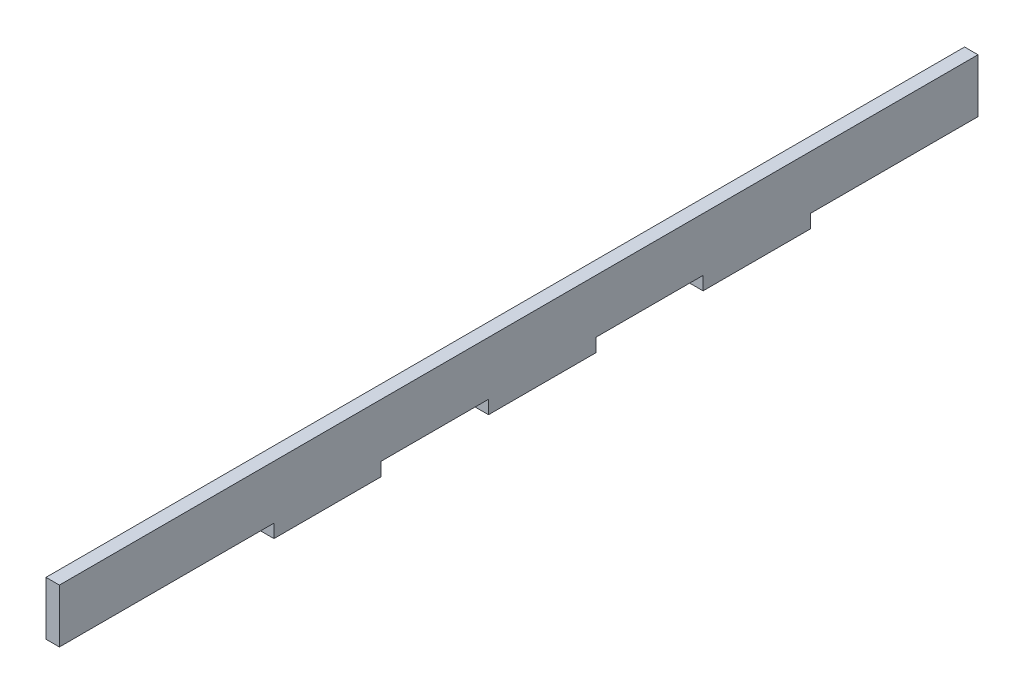
ISO-10303-21;
HEADER;
FILE_DESCRIPTION(('STEP AP214'),'2;1');
FILE_NAME('part.step','',(''),(''),'','','');
FILE_SCHEMA(('AUTOMOTIVE_DESIGN { 1 0 10303 214 1 1 1 1 }'));
ENDSEC;
DATA;
#1=APPLICATION_CONTEXT('core data for automotive mechanical design processes');
#2=APPLICATION_PROTOCOL_DEFINITION('international standard','automotive_design',2000,#1);
#3=PRODUCT_CONTEXT('',#1,'mechanical');
#4=PRODUCT('Part','Part','',(#3));
#5=PRODUCT_RELATED_PRODUCT_CATEGORY('part','',(#4));
#6=PRODUCT_DEFINITION_FORMATION('','',#4);
#7=PRODUCT_DEFINITION_CONTEXT('part definition',#1,'design');
#8=PRODUCT_DEFINITION('design','',#6,#7);
#9=PRODUCT_DEFINITION_SHAPE('','',#8);
#10=(LENGTH_UNIT() NAMED_UNIT(*) SI_UNIT(.MILLI.,.METRE.));
#11=(NAMED_UNIT(*) PLANE_ANGLE_UNIT() SI_UNIT($,.RADIAN.));
#12=(NAMED_UNIT(*) SI_UNIT($,.STERADIAN.) SOLID_ANGLE_UNIT());
#13=UNCERTAINTY_MEASURE_WITH_UNIT(LENGTH_MEASURE(1.E-05),#10,'distance_accuracy_value','');
#14=(GEOMETRIC_REPRESENTATION_CONTEXT(3) GLOBAL_UNCERTAINTY_ASSIGNED_CONTEXT((#13)) GLOBAL_UNIT_ASSIGNED_CONTEXT((#10,
#11,#12)) REPRESENTATION_CONTEXT('',''));
#15=CARTESIAN_POINT('',(0.,0.,0.));
#16=DIRECTION('',(0.,0.,1.));
#17=DIRECTION('',(1.,0.,0.));
#18=AXIS2_PLACEMENT_3D('',#15,#16,#17);
#19=CARTESIAN_POINT('',(6.35,0.,-3.13101566359819));
#20=DIRECTION('',(0.,1.,0.));
#21=DIRECTION('',(0.,0.,1.));
#22=AXIS2_PLACEMENT_3D('',#19,#20,#21);
#23=PLANE('',#22);
#24=DIRECTION('',(0.,0.,-1.));
#25=VECTOR('',#24,1.);
#26=CARTESIAN_POINT('',(0.,0.,-3.13101566359819));
#27=LINE('',#26,#25);
#28=CARTESIAN_POINT('',(0.,0.,-104.731015663598));
#29=VERTEX_POINT('',#28);
#30=CARTESIAN_POINT('',(0.,0.,-155.531015663598));
#31=VERTEX_POINT('',#30);
#32=EDGE_CURVE('E253',#29,#31,#27,.T.);
#33=ORIENTED_EDGE('',*,*,#32,.T.);
#34=DIRECTION('',(-1.,0.,0.));
#35=VECTOR('',#34,1.);
#36=CARTESIAN_POINT('',(6.351,0.,-155.531015663598));
#37=LINE('',#36,#35);
#38=CARTESIAN_POINT('',(6.35,0.,-155.531015663598));
#39=VERTEX_POINT('',#38);
#40=EDGE_CURVE('E162',#39,#31,#37,.T.);
#41=ORIENTED_EDGE('',*,*,#40,.F.);
#42=DIRECTION('',(0.,0.,-1.));
#43=VECTOR('',#42,1.);
#44=CARTESIAN_POINT('',(6.35,0.,-3.13101566359819));
#45=LINE('',#44,#43);
#46=CARTESIAN_POINT('',(6.35,0.,-104.731015663598));
#47=VERTEX_POINT('',#46);
#48=EDGE_CURVE('E168',#47,#39,#45,.T.);
#49=ORIENTED_EDGE('',*,*,#48,.F.);
#50=DIRECTION('',(-1.,0.,0.));
#51=VECTOR('',#50,1.);
#52=CARTESIAN_POINT('',(6.351,0.,-104.731015663598));
#53=LINE('',#52,#51);
#54=EDGE_CURVE('E230',#47,#29,#53,.T.);
#55=ORIENTED_EDGE('',*,*,#54,.T.);
#56=EDGE_LOOP('',(#33,#41,#49,#55));
#57=FACE_BOUND('',#56,.T.);
#58=ADVANCED_FACE('F33',(#57),#23,.F.);
#59=CARTESIAN_POINT('',(6.35,0.,-206.331015663598));
#60=VERTEX_POINT('',#59);
#61=CARTESIAN_POINT('',(6.35,0.,-257.131015663598));
#62=VERTEX_POINT('',#61);
#63=EDGE_CURVE('E246',#60,#62,#45,.T.);
#64=ORIENTED_EDGE('',*,*,#63,.F.);
#65=DIRECTION('',(-1.,0.,0.));
#66=VECTOR('',#65,1.);
#67=CARTESIAN_POINT('',(6.351,0.,-206.331015663598));
#68=LINE('',#67,#66);
#69=CARTESIAN_POINT('',(0.,0.,-206.331015663598));
#70=VERTEX_POINT('',#69);
#71=EDGE_CURVE('E179',#60,#70,#68,.T.);
#72=ORIENTED_EDGE('',*,*,#71,.T.);
#73=CARTESIAN_POINT('',(0.,0.,-257.131015663598));
#74=VERTEX_POINT('',#73);
#75=EDGE_CURVE('E257',#70,#74,#27,.T.);
#76=ORIENTED_EDGE('',*,*,#75,.T.);
#77=DIRECTION('',(-1.,0.,0.));
#78=VECTOR('',#77,1.);
#79=CARTESIAN_POINT('',(6.351,0.,-257.131015663598));
#80=LINE('',#79,#78);
#81=EDGE_CURVE('E196',#62,#74,#80,.T.);
#82=ORIENTED_EDGE('',*,*,#81,.F.);
#83=EDGE_LOOP('',(#64,#72,#76,#82));
#84=FACE_BOUND('',#83,.T.);
#85=ADVANCED_FACE('F304',(#84),#23,.F.);
#86=CARTESIAN_POINT('',(6.35,0.,-3.13101566359819));
#87=DIRECTION('',(0.,0.,-1.));
#88=DIRECTION('',(-1.,0.,0.));
#89=AXIS2_PLACEMENT_3D('',#86,#87,#88);
#90=PLANE('',#89);
#91=DIRECTION('',(0.,-1.,0.));
#92=VECTOR('',#91,1.);
#93=CARTESIAN_POINT('',(0.,0.,-3.13101566359819));
#94=LINE('',#93,#92);
#95=CARTESIAN_POINT('',(0.,31.75,-3.13101566359819));
#96=VERTEX_POINT('',#95);
#97=CARTESIAN_POINT('',(0.,6.34999999999999,-3.13101566359819));
#98=VERTEX_POINT('',#97);
#99=EDGE_CURVE('E238',#96,#98,#94,.T.);
#100=ORIENTED_EDGE('',*,*,#99,.T.);
#101=DIRECTION('',(-1.,0.,0.));
#102=VECTOR('',#101,1.);
#103=CARTESIAN_POINT('',(6.351,6.35,-3.13101566359819));
#104=LINE('',#103,#102);
#105=CARTESIAN_POINT('',(6.35,6.34999999999999,-3.13101566359819));
#106=VERTEX_POINT('',#105);
#107=EDGE_CURVE('E229',#106,#98,#104,.T.);
#108=ORIENTED_EDGE('',*,*,#107,.F.);
#109=DIRECTION('',(0.,-1.,0.));
#110=VECTOR('',#109,1.);
#111=CARTESIAN_POINT('',(6.35,0.,-3.13101566359819));
#112=LINE('',#111,#110);
#113=CARTESIAN_POINT('',(6.35,31.75,-3.13101566359819));
#114=VERTEX_POINT('',#113);
#115=EDGE_CURVE('E239',#114,#106,#112,.T.);
#116=ORIENTED_EDGE('',*,*,#115,.F.);
#117=DIRECTION('',(-1.,0.,0.));
#118=VECTOR('',#117,1.);
#119=CARTESIAN_POINT('',(6.35,31.75,-3.13101566359819));
#120=LINE('',#119,#118);
#121=EDGE_CURVE('E41',#114,#96,#120,.T.);
#122=ORIENTED_EDGE('',*,*,#121,.T.);
#123=EDGE_LOOP('',(#100,#108,#116,#122));
#124=FACE_BOUND('',#123,.T.);
#125=ADVANCED_FACE('F35',(#124),#90,.F.);
#126=CARTESIAN_POINT('',(6.35,0.,-307.931015663598));
#127=VERTEX_POINT('',#126);
#128=CARTESIAN_POINT('',(6.35,0.,-358.731015663598));
#129=VERTEX_POINT('',#128);
#130=EDGE_CURVE('E242',#127,#129,#45,.T.);
#131=ORIENTED_EDGE('',*,*,#130,.F.);
#132=DIRECTION('',(-1.,0.,0.));
#133=VECTOR('',#132,1.);
#134=CARTESIAN_POINT('',(6.351,0.,-307.931015663598));
#135=LINE('',#134,#133);
#136=CARTESIAN_POINT('',(0.,0.,-307.931015663598));
#137=VERTEX_POINT('',#136);
#138=EDGE_CURVE('E198',#127,#137,#135,.T.);
#139=ORIENTED_EDGE('',*,*,#138,.T.);
#140=CARTESIAN_POINT('',(0.,0.,-358.731015663598));
#141=VERTEX_POINT('',#140);
#142=EDGE_CURVE('E252',#137,#141,#27,.T.);
#143=ORIENTED_EDGE('',*,*,#142,.T.);
#144=DIRECTION('',(-1.,0.,0.));
#145=VECTOR('',#144,1.);
#146=CARTESIAN_POINT('',(6.351,0.,-358.731015663598));
#147=LINE('',#146,#145);
#148=EDGE_CURVE('E216',#129,#141,#147,.T.);
#149=ORIENTED_EDGE('',*,*,#148,.F.);
#150=EDGE_LOOP('',(#131,#139,#143,#149));
#151=FACE_BOUND('',#150,.T.);
#152=ADVANCED_FACE('F296',(#151),#23,.F.);
#153=CARTESIAN_POINT('',(6.35,0.,-438.131015663598));
#154=DIRECTION('',(0.,0.,1.));
#155=DIRECTION('',(1.,0.,0.));
#156=AXIS2_PLACEMENT_3D('',#153,#154,#155);
#157=PLANE('',#156);
#158=DIRECTION('',(0.,1.,0.));
#159=VECTOR('',#158,1.);
#160=CARTESIAN_POINT('',(6.35,0.,-438.131015663598));
#161=LINE('',#160,#159);
#162=CARTESIAN_POINT('',(6.35,6.34999999999995,-438.131015663598));
#163=VERTEX_POINT('',#162);
#164=CARTESIAN_POINT('',(6.35,31.75,-438.131015663598));
#165=VERTEX_POINT('',#164);
#166=EDGE_CURVE('E245',#163,#165,#161,.T.);
#167=ORIENTED_EDGE('',*,*,#166,.F.);
#168=DIRECTION('',(-1.,0.,0.));
#169=VECTOR('',#168,1.);
#170=CARTESIAN_POINT('',(6.351,6.34999999999995,-438.131015663598));
#171=LINE('',#170,#169);
#172=CARTESIAN_POINT('',(0.,6.34999999999995,-438.131015663598));
#173=VERTEX_POINT('',#172);
#174=EDGE_CURVE('E187',#163,#173,#171,.T.);
#175=ORIENTED_EDGE('',*,*,#174,.T.);
#176=DIRECTION('',(0.,1.,0.));
#177=VECTOR('',#176,1.);
#178=CARTESIAN_POINT('',(0.,0.,-438.131015663598));
#179=LINE('',#178,#177);
#180=CARTESIAN_POINT('',(0.,31.75,-438.131015663598));
#181=VERTEX_POINT('',#180);
#182=EDGE_CURVE('E256',#173,#181,#179,.T.);
#183=ORIENTED_EDGE('',*,*,#182,.T.);
#184=DIRECTION('',(-1.,0.,0.));
#185=VECTOR('',#184,1.);
#186=CARTESIAN_POINT('',(6.35,31.75,-438.131015663598));
#187=LINE('',#186,#185);
#188=EDGE_CURVE('E11',#165,#181,#187,.T.);
#189=ORIENTED_EDGE('',*,*,#188,.F.);
#190=EDGE_LOOP('',(#167,#175,#183,#189));
#191=FACE_BOUND('',#190,.T.);
#192=ADVANCED_FACE('F282',(#191),#157,.F.);
#193=CARTESIAN_POINT('',(6.35,31.75,-3.13101566359819));
#194=DIRECTION('',(0.,-1.,0.));
#195=DIRECTION('',(0.,0.,-1.));
#196=AXIS2_PLACEMENT_3D('',#193,#194,#195);
#197=PLANE('',#196);
#198=DIRECTION('',(0.,0.,1.));
#199=VECTOR('',#198,1.);
#200=CARTESIAN_POINT('',(0.,31.75,-3.13101566359819));
#201=LINE('',#200,#199);
#202=EDGE_CURVE('E243',#181,#96,#201,.T.);
#203=ORIENTED_EDGE('',*,*,#202,.T.);
#204=ORIENTED_EDGE('',*,*,#121,.F.);
#205=DIRECTION('',(0.,0.,1.));
#206=VECTOR('',#205,1.);
#207=CARTESIAN_POINT('',(6.35,31.75,-3.13101566359819));
#208=LINE('',#207,#206);
#209=EDGE_CURVE('E248',#165,#114,#208,.T.);
#210=ORIENTED_EDGE('',*,*,#209,.F.);
#211=ORIENTED_EDGE('',*,*,#188,.T.);
#212=EDGE_LOOP('',(#203,#204,#210,#211));
#213=FACE_BOUND('',#212,.T.);
#214=ADVANCED_FACE('F280',(#213),#197,.F.);
#215=CARTESIAN_POINT('',(6.35,0.,0.));
#216=DIRECTION('',(-1.,0.,0.));
#217=DIRECTION('',(0.,0.,1.));
#218=AXIS2_PLACEMENT_3D('',#215,#216,#217);
#219=PLANE('',#218);
#220=ORIENTED_EDGE('',*,*,#48,.T.);
#221=DIRECTION('',(0.,-1.,0.));
#222=VECTOR('',#221,1.);
#223=CARTESIAN_POINT('',(6.35,0.,-155.531015663598));
#224=LINE('',#223,#222);
#225=CARTESIAN_POINT('',(6.35,6.34999999999998,-155.531015663598));
#226=VERTEX_POINT('',#225);
#227=EDGE_CURVE('E147',#226,#39,#224,.T.);
#228=ORIENTED_EDGE('',*,*,#227,.F.);
#229=DIRECTION('',(0.,0.,1.));
#230=VECTOR('',#229,1.);
#231=CARTESIAN_POINT('',(6.35,6.34999999999998,-155.531015663598));
#232=LINE('',#231,#230);
#233=CARTESIAN_POINT('',(6.35,6.34999999999998,-206.331015663598));
#234=VERTEX_POINT('',#233);
#235=EDGE_CURVE('E156',#234,#226,#232,.T.);
#236=ORIENTED_EDGE('',*,*,#235,.F.);
#237=DIRECTION('',(0.,1.,0.));
#238=VECTOR('',#237,1.);
#239=CARTESIAN_POINT('',(6.35,0.,-206.331015663598));
#240=LINE('',#239,#238);
#241=EDGE_CURVE('E169',#60,#234,#240,.T.);
#242=ORIENTED_EDGE('',*,*,#241,.F.);
#243=ORIENTED_EDGE('',*,*,#63,.T.);
#244=DIRECTION('',(0.,-1.,0.));
#245=VECTOR('',#244,1.);
#246=CARTESIAN_POINT('',(6.35,0.,-257.131015663598));
#247=LINE('',#246,#245);
#248=CARTESIAN_POINT('',(6.35,6.34999999999998,-257.131015663598));
#249=VERTEX_POINT('',#248);
#250=EDGE_CURVE('E186',#249,#62,#247,.T.);
#251=ORIENTED_EDGE('',*,*,#250,.F.);
#252=DIRECTION('',(0.,0.,1.));
#253=VECTOR('',#252,1.);
#254=CARTESIAN_POINT('',(6.35,6.34999999999998,-257.131015663598));
#255=LINE('',#254,#253);
#256=CARTESIAN_POINT('',(6.35,6.34999999999997,-307.931015663598));
#257=VERTEX_POINT('',#256);
#258=EDGE_CURVE('E173',#257,#249,#255,.T.);
#259=ORIENTED_EDGE('',*,*,#258,.F.);
#260=DIRECTION('',(0.,1.,0.));
#261=VECTOR('',#260,1.);
#262=CARTESIAN_POINT('',(6.35,0.,-307.931015663598));
#263=LINE('',#262,#261);
#264=EDGE_CURVE('E183',#127,#257,#263,.T.);
#265=ORIENTED_EDGE('',*,*,#264,.F.);
#266=ORIENTED_EDGE('',*,*,#130,.T.);
#267=DIRECTION('',(0.,-1.,0.));
#268=VECTOR('',#267,1.);
#269=CARTESIAN_POINT('',(6.35,0.,-358.731015663598));
#270=LINE('',#269,#268);
#271=CARTESIAN_POINT('',(6.35,6.34999999999991,-358.731015663598));
#272=VERTEX_POINT('',#271);
#273=EDGE_CURVE('E206',#272,#129,#270,.T.);
#274=ORIENTED_EDGE('',*,*,#273,.F.);
#275=DIRECTION('',(0.,0.,1.));
#276=VECTOR('',#275,1.);
#277=CARTESIAN_POINT('',(6.35,6.34999999999995,-438.131015663598));
#278=LINE('',#277,#276);
#279=EDGE_CURVE('E208',#163,#272,#278,.T.);
#280=ORIENTED_EDGE('',*,*,#279,.F.);
#281=ORIENTED_EDGE('',*,*,#166,.T.);
#282=ORIENTED_EDGE('',*,*,#209,.T.);
#283=ORIENTED_EDGE('',*,*,#115,.T.);
#284=DIRECTION('',(0.,0.,1.));
#285=VECTOR('',#284,1.);
#286=CARTESIAN_POINT('',(6.35,6.35,-3.13101566359819));
#287=LINE('',#286,#285);
#288=CARTESIAN_POINT('',(6.35,6.34999999999999,-104.731015663598));
#289=VERTEX_POINT('',#288);
#290=EDGE_CURVE('E233',#289,#106,#287,.T.);
#291=ORIENTED_EDGE('',*,*,#290,.F.);
#292=DIRECTION('',(0.,1.,0.));
#293=VECTOR('',#292,1.);
#294=CARTESIAN_POINT('',(6.35,0.,-104.731015663598));
#295=LINE('',#294,#293);
#296=EDGE_CURVE('E161',#47,#289,#295,.T.);
#297=ORIENTED_EDGE('',*,*,#296,.F.);
#298=EDGE_LOOP('',(#220,#228,#236,#242,#243,#251,#259,#265,#266,#274,#280,#281,#282,#283,#291,#297));
#299=FACE_BOUND('',#298,.T.);
#300=ADVANCED_FACE('F165',(#299),#219,.F.);
#301=CARTESIAN_POINT('',(0.,0.,0.));
#302=DIRECTION('',(-1.,0.,0.));
#303=DIRECTION('',(0.,0.,1.));
#304=AXIS2_PLACEMENT_3D('',#301,#302,#303);
#305=PLANE('',#304);
#306=DIRECTION('',(0.,1.,0.));
#307=VECTOR('',#306,1.);
#308=CARTESIAN_POINT('',(0.,0.,-155.531015663598));
#309=LINE('',#308,#307);
#310=CARTESIAN_POINT('',(0.,6.34999999999998,-155.531015663598));
#311=VERTEX_POINT('',#310);
#312=EDGE_CURVE('E48',#31,#311,#309,.T.);
#313=ORIENTED_EDGE('',*,*,#312,.F.);
#314=ORIENTED_EDGE('',*,*,#32,.F.);
#315=DIRECTION('',(0.,-1.,0.));
#316=VECTOR('',#315,1.);
#317=CARTESIAN_POINT('',(0.,0.,-104.731015663598));
#318=LINE('',#317,#316);
#319=CARTESIAN_POINT('',(0.,6.34999999999999,-104.731015663598));
#320=VERTEX_POINT('',#319);
#321=EDGE_CURVE('E227',#320,#29,#318,.T.);
#322=ORIENTED_EDGE('',*,*,#321,.F.);
#323=DIRECTION('',(0.,0.,-1.));
#324=VECTOR('',#323,1.);
#325=CARTESIAN_POINT('',(0.,6.35,-3.13101566359819));
#326=LINE('',#325,#324);
#327=EDGE_CURVE('E224',#98,#320,#326,.T.);
#328=ORIENTED_EDGE('',*,*,#327,.F.);
#329=ORIENTED_EDGE('',*,*,#99,.F.);
#330=ORIENTED_EDGE('',*,*,#202,.F.);
#331=ORIENTED_EDGE('',*,*,#182,.F.);
#332=DIRECTION('',(0.,0.,-1.));
#333=VECTOR('',#332,1.);
#334=CARTESIAN_POINT('',(0.,6.34999999999995,-438.131015663598));
#335=LINE('',#334,#333);
#336=CARTESIAN_POINT('',(0.,6.34999999999991,-358.731015663598));
#337=VERTEX_POINT('',#336);
#338=EDGE_CURVE('E214',#337,#173,#335,.T.);
#339=ORIENTED_EDGE('',*,*,#338,.F.);
#340=DIRECTION('',(0.,1.,0.));
#341=VECTOR('',#340,1.);
#342=CARTESIAN_POINT('',(0.,0.,-358.731015663598));
#343=LINE('',#342,#341);
#344=EDGE_CURVE('E211',#141,#337,#343,.T.);
#345=ORIENTED_EDGE('',*,*,#344,.F.);
#346=ORIENTED_EDGE('',*,*,#142,.F.);
#347=DIRECTION('',(0.,-1.,0.));
#348=VECTOR('',#347,1.);
#349=CARTESIAN_POINT('',(0.,0.,-307.931015663598));
#350=LINE('',#349,#348);
#351=CARTESIAN_POINT('',(0.,6.34999999999997,-307.931015663598));
#352=VERTEX_POINT('',#351);
#353=EDGE_CURVE('E193',#352,#137,#350,.T.);
#354=ORIENTED_EDGE('',*,*,#353,.F.);
#355=DIRECTION('',(0.,0.,-1.));
#356=VECTOR('',#355,1.);
#357=CARTESIAN_POINT('',(0.,6.34999999999998,-257.131015663598));
#358=LINE('',#357,#356);
#359=CARTESIAN_POINT('',(0.,6.34999999999998,-257.131015663598));
#360=VERTEX_POINT('',#359);
#361=EDGE_CURVE('E190',#360,#352,#358,.T.);
#362=ORIENTED_EDGE('',*,*,#361,.F.);
#363=DIRECTION('',(0.,1.,0.));
#364=VECTOR('',#363,1.);
#365=CARTESIAN_POINT('',(0.,0.,-257.131015663598));
#366=LINE('',#365,#364);
#367=EDGE_CURVE('E56',#74,#360,#366,.T.);
#368=ORIENTED_EDGE('',*,*,#367,.F.);
#369=ORIENTED_EDGE('',*,*,#75,.F.);
#370=DIRECTION('',(0.,-1.,0.));
#371=VECTOR('',#370,1.);
#372=CARTESIAN_POINT('',(0.,0.,-206.331015663598));
#373=LINE('',#372,#371);
#374=CARTESIAN_POINT('',(0.,6.34999999999998,-206.331015663598));
#375=VERTEX_POINT('',#374);
#376=EDGE_CURVE('E153',#375,#70,#373,.T.);
#377=ORIENTED_EDGE('',*,*,#376,.F.);
#378=DIRECTION('',(0.,0.,-1.));
#379=VECTOR('',#378,1.);
#380=CARTESIAN_POINT('',(0.,6.34999999999998,-155.531015663598));
#381=LINE('',#380,#379);
#382=EDGE_CURVE('E171',#311,#375,#381,.T.);
#383=ORIENTED_EDGE('',*,*,#382,.F.);
#384=EDGE_LOOP('',(#313,#314,#322,#328,#329,#330,#331,#339,#345,#346,#354,#362,#368,#369,#377,#383));
#385=FACE_BOUND('',#384,.T.);
#386=ADVANCED_FACE('F270',(#385),#305,.T.);
#387=CARTESIAN_POINT('',(6.351,0.,-104.731015663598));
#388=DIRECTION('',(0.,0.,-1.));
#389=DIRECTION('',(-1.,0.,0.));
#390=AXIS2_PLACEMENT_3D('',#387,#388,#389);
#391=PLANE('',#390);
#392=ORIENTED_EDGE('',*,*,#296,.T.);
#393=DIRECTION('',(-1.,0.,0.));
#394=VECTOR('',#393,1.);
#395=CARTESIAN_POINT('',(6.351,6.34999999999999,-104.731015663598));
#396=LINE('',#395,#394);
#397=EDGE_CURVE('E234',#289,#320,#396,.T.);
#398=ORIENTED_EDGE('',*,*,#397,.T.);
#399=ORIENTED_EDGE('',*,*,#321,.T.);
#400=ORIENTED_EDGE('',*,*,#54,.F.);
#401=EDGE_LOOP('',(#392,#398,#399,#400));
#402=FACE_BOUND('',#401,.T.);
#403=ADVANCED_FACE('F376',(#402),#391,.F.);
#404=CARTESIAN_POINT('',(6.351,6.35,-3.13101566359819));
#405=DIRECTION('',(0.,1.,0.));
#406=DIRECTION('',(0.,0.,1.));
#407=AXIS2_PLACEMENT_3D('',#404,#405,#406);
#408=PLANE('',#407);
#409=ORIENTED_EDGE('',*,*,#290,.T.);
#410=ORIENTED_EDGE('',*,*,#107,.T.);
#411=ORIENTED_EDGE('',*,*,#327,.T.);
#412=ORIENTED_EDGE('',*,*,#397,.F.);
#413=EDGE_LOOP('',(#409,#410,#411,#412));
#414=FACE_BOUND('',#413,.T.);
#415=ADVANCED_FACE('F275',(#414),#408,.F.);
#416=CARTESIAN_POINT('',(6.351,6.34999999999995,-438.131015663598));
#417=DIRECTION('',(0.,1.,0.));
#418=DIRECTION('',(0.,0.,1.));
#419=AXIS2_PLACEMENT_3D('',#416,#417,#418);
#420=PLANE('',#419);
#421=ORIENTED_EDGE('',*,*,#279,.T.);
#422=DIRECTION('',(-1.,0.,0.));
#423=VECTOR('',#422,1.);
#424=CARTESIAN_POINT('',(6.351,6.34999999999991,-358.731015663598));
#425=LINE('',#424,#423);
#426=EDGE_CURVE('E219',#272,#337,#425,.T.);
#427=ORIENTED_EDGE('',*,*,#426,.T.);
#428=ORIENTED_EDGE('',*,*,#338,.T.);
#429=ORIENTED_EDGE('',*,*,#174,.F.);
#430=EDGE_LOOP('',(#421,#427,#428,#429));
#431=FACE_BOUND('',#430,.T.);
#432=ADVANCED_FACE('F288',(#431),#420,.F.);
#433=CARTESIAN_POINT('',(6.351,0.,-358.731015663598));
#434=DIRECTION('',(0.,0.,1.));
#435=DIRECTION('',(1.,0.,0.));
#436=AXIS2_PLACEMENT_3D('',#433,#434,#435);
#437=PLANE('',#436);
#438=ORIENTED_EDGE('',*,*,#273,.T.);
#439=ORIENTED_EDGE('',*,*,#148,.T.);
#440=ORIENTED_EDGE('',*,*,#344,.T.);
#441=ORIENTED_EDGE('',*,*,#426,.F.);
#442=EDGE_LOOP('',(#438,#439,#440,#441));
#443=FACE_BOUND('',#442,.T.);
#444=ADVANCED_FACE('F291',(#443),#437,.F.);
#445=CARTESIAN_POINT('',(6.351,0.,-257.131015663598));
#446=DIRECTION('',(0.,0.,1.));
#447=DIRECTION('',(1.,0.,0.));
#448=AXIS2_PLACEMENT_3D('',#445,#446,#447);
#449=PLANE('',#448);
#450=ORIENTED_EDGE('',*,*,#250,.T.);
#451=ORIENTED_EDGE('',*,*,#81,.T.);
#452=ORIENTED_EDGE('',*,*,#367,.T.);
#453=DIRECTION('',(-1.,0.,0.));
#454=VECTOR('',#453,1.);
#455=CARTESIAN_POINT('',(6.351,6.34999999999998,-257.131015663598));
#456=LINE('',#455,#454);
#457=EDGE_CURVE('E195',#249,#360,#456,.T.);
#458=ORIENTED_EDGE('',*,*,#457,.F.);
#459=EDGE_LOOP('',(#450,#451,#452,#458));
#460=FACE_BOUND('',#459,.T.);
#461=ADVANCED_FACE('F307',(#460),#449,.F.);
#462=CARTESIAN_POINT('',(6.351,0.,-307.931015663598));
#463=DIRECTION('',(0.,0.,-1.));
#464=DIRECTION('',(-1.,0.,0.));
#465=AXIS2_PLACEMENT_3D('',#462,#463,#464);
#466=PLANE('',#465);
#467=ORIENTED_EDGE('',*,*,#264,.T.);
#468=DIRECTION('',(-1.,0.,0.));
#469=VECTOR('',#468,1.);
#470=CARTESIAN_POINT('',(6.351,6.34999999999997,-307.931015663598));
#471=LINE('',#470,#469);
#472=EDGE_CURVE('E201',#257,#352,#471,.T.);
#473=ORIENTED_EDGE('',*,*,#472,.T.);
#474=ORIENTED_EDGE('',*,*,#353,.T.);
#475=ORIENTED_EDGE('',*,*,#138,.F.);
#476=EDGE_LOOP('',(#467,#473,#474,#475));
#477=FACE_BOUND('',#476,.T.);
#478=ADVANCED_FACE('F314',(#477),#466,.F.);
#479=CARTESIAN_POINT('',(6.351,6.34999999999998,-257.131015663598));
#480=DIRECTION('',(0.,1.,0.));
#481=DIRECTION('',(0.,0.,1.));
#482=AXIS2_PLACEMENT_3D('',#479,#480,#481);
#483=PLANE('',#482);
#484=ORIENTED_EDGE('',*,*,#258,.T.);
#485=ORIENTED_EDGE('',*,*,#457,.T.);
#486=ORIENTED_EDGE('',*,*,#361,.T.);
#487=ORIENTED_EDGE('',*,*,#472,.F.);
#488=EDGE_LOOP('',(#484,#485,#486,#487));
#489=FACE_BOUND('',#488,.T.);
#490=ADVANCED_FACE('F312',(#489),#483,.F.);
#491=CARTESIAN_POINT('',(6.351,0.,-155.531015663598));
#492=DIRECTION('',(0.,0.,1.));
#493=DIRECTION('',(1.,0.,0.));
#494=AXIS2_PLACEMENT_3D('',#491,#492,#493);
#495=PLANE('',#494);
#496=ORIENTED_EDGE('',*,*,#227,.T.);
#497=ORIENTED_EDGE('',*,*,#40,.T.);
#498=ORIENTED_EDGE('',*,*,#312,.T.);
#499=DIRECTION('',(-1.,0.,0.));
#500=VECTOR('',#499,1.);
#501=CARTESIAN_POINT('',(6.351,6.34999999999998,-155.531015663598));
#502=LINE('',#501,#500);
#503=EDGE_CURVE('E143',#226,#311,#502,.T.);
#504=ORIENTED_EDGE('',*,*,#503,.F.);
#505=EDGE_LOOP('',(#496,#497,#498,#504));
#506=FACE_BOUND('',#505,.T.);
#507=ADVANCED_FACE('F145',(#506),#495,.F.);
#508=CARTESIAN_POINT('',(6.351,0.,-206.331015663598));
#509=DIRECTION('',(0.,0.,-1.));
#510=DIRECTION('',(-1.,0.,0.));
#511=AXIS2_PLACEMENT_3D('',#508,#509,#510);
#512=PLANE('',#511);
#513=ORIENTED_EDGE('',*,*,#241,.T.);
#514=DIRECTION('',(-1.,0.,0.));
#515=VECTOR('',#514,1.);
#516=CARTESIAN_POINT('',(6.351,6.34999999999998,-206.331015663598));
#517=LINE('',#516,#515);
#518=EDGE_CURVE('E152',#234,#375,#517,.T.);
#519=ORIENTED_EDGE('',*,*,#518,.T.);
#520=ORIENTED_EDGE('',*,*,#376,.T.);
#521=ORIENTED_EDGE('',*,*,#71,.F.);
#522=EDGE_LOOP('',(#513,#519,#520,#521));
#523=FACE_BOUND('',#522,.T.);
#524=ADVANCED_FACE('F420',(#523),#512,.F.);
#525=CARTESIAN_POINT('',(6.351,6.34999999999998,-155.531015663598));
#526=DIRECTION('',(0.,1.,0.));
#527=DIRECTION('',(0.,0.,1.));
#528=AXIS2_PLACEMENT_3D('',#525,#526,#527);
#529=PLANE('',#528);
#530=ORIENTED_EDGE('',*,*,#235,.T.);
#531=ORIENTED_EDGE('',*,*,#503,.T.);
#532=ORIENTED_EDGE('',*,*,#382,.T.);
#533=ORIENTED_EDGE('',*,*,#518,.F.);
#534=EDGE_LOOP('',(#530,#531,#532,#533));
#535=FACE_BOUND('',#534,.T.);
#536=ADVANCED_FACE('F157',(#535),#529,.F.);
#537=CLOSED_SHELL('',(#58,#85,#125,#152,#192,#214,#300,#386,#403,#415,#432,#444,#461,#478,#490,
#507,#524,#536));
#538=MANIFOLD_SOLID_BREP('B2',#537);
#539=ADVANCED_BREP_SHAPE_REPRESENTATION('',(#18,#538),#14);
#540=SHAPE_DEFINITION_REPRESENTATION(#9,#539);
ENDSEC;
END-ISO-10303-21;
